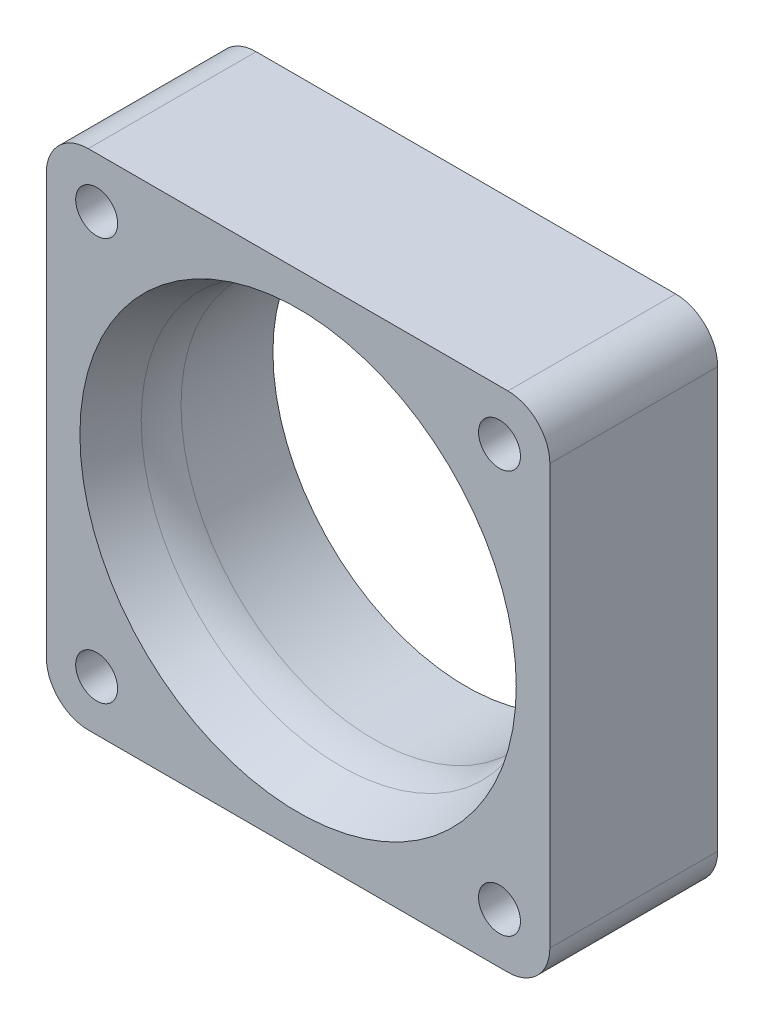
ISO-10303-21;
HEADER;
FILE_DESCRIPTION(('STEP AP214'),'2;1');
FILE_NAME('part.step','',(''),(''),'','','');
FILE_SCHEMA(('AUTOMOTIVE_DESIGN { 1 0 10303 214 1 1 1 1 }'));
ENDSEC;
DATA;
#1=APPLICATION_CONTEXT('core data for automotive mechanical design processes');
#2=APPLICATION_PROTOCOL_DEFINITION('international standard','automotive_design',2000,#1);
#3=PRODUCT_CONTEXT('',#1,'mechanical');
#4=PRODUCT('Part','Part','',(#3));
#5=PRODUCT_RELATED_PRODUCT_CATEGORY('part','',(#4));
#6=PRODUCT_DEFINITION_FORMATION('','',#4);
#7=PRODUCT_DEFINITION_CONTEXT('part definition',#1,'design');
#8=PRODUCT_DEFINITION('design','',#6,#7);
#9=PRODUCT_DEFINITION_SHAPE('','',#8);
#10=(LENGTH_UNIT() NAMED_UNIT(*) SI_UNIT(.MILLI.,.METRE.));
#11=(NAMED_UNIT(*) PLANE_ANGLE_UNIT() SI_UNIT($,.RADIAN.));
#12=(NAMED_UNIT(*) SI_UNIT($,.STERADIAN.) SOLID_ANGLE_UNIT());
#13=UNCERTAINTY_MEASURE_WITH_UNIT(LENGTH_MEASURE(1.E-05),#10,'distance_accuracy_value','');
#14=(GEOMETRIC_REPRESENTATION_CONTEXT(3) GLOBAL_UNCERTAINTY_ASSIGNED_CONTEXT((#13)) GLOBAL_UNIT_ASSIGNED_CONTEXT((#10,
#11,#12)) REPRESENTATION_CONTEXT('',''));
#15=CARTESIAN_POINT('',(0.,0.,0.));
#16=DIRECTION('',(0.,0.,1.));
#17=DIRECTION('',(1.,0.,0.));
#18=AXIS2_PLACEMENT_3D('',#15,#16,#17);
#19=CARTESIAN_POINT('',(15.,-15.,10.));
#20=DIRECTION('',(-1.,0.,0.));
#21=DIRECTION('',(0.,0.,1.));
#22=AXIS2_PLACEMENT_3D('',#19,#20,#21);
#23=PLANE('',#22);
#24=DIRECTION('',(0.,1.,0.));
#25=VECTOR('',#24,1.);
#26=CARTESIAN_POINT('',(15.,-15.,10.));
#27=LINE('',#26,#25);
#28=CARTESIAN_POINT('',(15.,-12.5,10.));
#29=VERTEX_POINT('',#28);
#30=CARTESIAN_POINT('',(15.,12.5,10.));
#31=VERTEX_POINT('',#30);
#32=EDGE_CURVE('E126',#29,#31,#27,.T.);
#33=ORIENTED_EDGE('',*,*,#32,.F.);
#34=DIRECTION('',(0.,0.,-1.));
#35=VECTOR('',#34,1.);
#36=CARTESIAN_POINT('',(15.,-12.5,10.));
#37=LINE('',#36,#35);
#38=CARTESIAN_POINT('',(15.,-12.5,0.));
#39=VERTEX_POINT('',#38);
#40=EDGE_CURVE('E152',#29,#39,#37,.T.);
#41=ORIENTED_EDGE('',*,*,#40,.T.);
#42=DIRECTION('',(0.,1.,0.));
#43=VECTOR('',#42,1.);
#44=CARTESIAN_POINT('',(15.,-15.,0.));
#45=LINE('',#44,#43);
#46=CARTESIAN_POINT('',(15.,12.5,0.));
#47=VERTEX_POINT('',#46);
#48=EDGE_CURVE('E208',#39,#47,#45,.T.);
#49=ORIENTED_EDGE('',*,*,#48,.T.);
#50=DIRECTION('',(0.,0.,-1.));
#51=VECTOR('',#50,1.);
#52=CARTESIAN_POINT('',(15.,12.5,10.));
#53=LINE('',#52,#51);
#54=EDGE_CURVE('E150',#47,#31,#53,.F.);
#55=ORIENTED_EDGE('',*,*,#54,.T.);
#56=EDGE_LOOP('',(#33,#41,#49,#55));
#57=FACE_BOUND('',#56,.T.);
#58=ADVANCED_FACE('F33',(#57),#23,.F.);
#59=CARTESIAN_POINT('',(-15.,15.,10.));
#60=DIRECTION('',(0.,-1.,0.));
#61=DIRECTION('',(0.,0.,-1.));
#62=AXIS2_PLACEMENT_3D('',#59,#60,#61);
#63=PLANE('',#62);
#64=DIRECTION('',(-1.,0.,0.));
#65=VECTOR('',#64,1.);
#66=CARTESIAN_POINT('',(-15.,15.,0.));
#67=LINE('',#66,#65);
#68=CARTESIAN_POINT('',(12.5,15.,0.));
#69=VERTEX_POINT('',#68);
#70=CARTESIAN_POINT('',(-12.5,15.,0.));
#71=VERTEX_POINT('',#70);
#72=EDGE_CURVE('E131',#69,#71,#67,.T.);
#73=ORIENTED_EDGE('',*,*,#72,.T.);
#74=DIRECTION('',(0.,0.,-1.));
#75=VECTOR('',#74,1.);
#76=CARTESIAN_POINT('',(-12.5,15.,10.));
#77=LINE('',#76,#75);
#78=CARTESIAN_POINT('',(-12.5,15.,10.));
#79=VERTEX_POINT('',#78);
#80=EDGE_CURVE('E48',#71,#79,#77,.F.);
#81=ORIENTED_EDGE('',*,*,#80,.T.);
#82=DIRECTION('',(-1.,0.,0.));
#83=VECTOR('',#82,1.);
#84=CARTESIAN_POINT('',(-15.,15.,10.));
#85=LINE('',#84,#83);
#86=CARTESIAN_POINT('',(12.5,15.,10.));
#87=VERTEX_POINT('',#86);
#88=EDGE_CURVE('E129',#87,#79,#85,.T.);
#89=ORIENTED_EDGE('',*,*,#88,.F.);
#90=DIRECTION('',(0.,0.,-1.));
#91=VECTOR('',#90,1.);
#92=CARTESIAN_POINT('',(12.5,15.,10.));
#93=LINE('',#92,#91);
#94=EDGE_CURVE('E155',#87,#69,#93,.T.);
#95=ORIENTED_EDGE('',*,*,#94,.T.);
#96=EDGE_LOOP('',(#73,#81,#89,#95));
#97=FACE_BOUND('',#96,.T.);
#98=ADVANCED_FACE('F174',(#97),#63,.F.);
#99=CARTESIAN_POINT('',(-15.,-15.,10.));
#100=DIRECTION('',(1.,0.,0.));
#101=DIRECTION('',(0.,0.,-1.));
#102=AXIS2_PLACEMENT_3D('',#99,#100,#101);
#103=PLANE('',#102);
#104=DIRECTION('',(0.,-1.,0.));
#105=VECTOR('',#104,1.);
#106=CARTESIAN_POINT('',(-15.,-15.,0.));
#107=LINE('',#106,#105);
#108=CARTESIAN_POINT('',(-15.,12.5,0.));
#109=VERTEX_POINT('',#108);
#110=CARTESIAN_POINT('',(-15.,-12.5,0.));
#111=VERTEX_POINT('',#110);
#112=EDGE_CURVE('E127',#109,#111,#107,.T.);
#113=ORIENTED_EDGE('',*,*,#112,.T.);
#114=DIRECTION('',(0.,0.,-1.));
#115=VECTOR('',#114,1.);
#116=CARTESIAN_POINT('',(-15.,-12.5,10.));
#117=LINE('',#116,#115);
#118=CARTESIAN_POINT('',(-15.,-12.5,10.));
#119=VERTEX_POINT('',#118);
#120=EDGE_CURVE('E105',#111,#119,#117,.F.);
#121=ORIENTED_EDGE('',*,*,#120,.T.);
#122=DIRECTION('',(0.,-1.,0.));
#123=VECTOR('',#122,1.);
#124=CARTESIAN_POINT('',(-15.,-15.,10.));
#125=LINE('',#124,#123);
#126=CARTESIAN_POINT('',(-15.,12.5,10.));
#127=VERTEX_POINT('',#126);
#128=EDGE_CURVE('E213',#127,#119,#125,.T.);
#129=ORIENTED_EDGE('',*,*,#128,.F.);
#130=DIRECTION('',(0.,0.,-1.));
#131=VECTOR('',#130,1.);
#132=CARTESIAN_POINT('',(-15.,12.5,10.));
#133=LINE('',#132,#131);
#134=EDGE_CURVE('E110',#127,#109,#133,.T.);
#135=ORIENTED_EDGE('',*,*,#134,.T.);
#136=EDGE_LOOP('',(#113,#121,#129,#135));
#137=FACE_BOUND('',#136,.T.);
#138=ADVANCED_FACE('F180',(#137),#103,.F.);
#139=CARTESIAN_POINT('',(-15.,-15.,10.));
#140=DIRECTION('',(0.,1.,0.));
#141=DIRECTION('',(0.,0.,1.));
#142=AXIS2_PLACEMENT_3D('',#139,#140,#141);
#143=PLANE('',#142);
#144=DIRECTION('',(1.,0.,0.));
#145=VECTOR('',#144,1.);
#146=CARTESIAN_POINT('',(-15.,-15.,10.));
#147=LINE('',#146,#145);
#148=CARTESIAN_POINT('',(-12.5,-15.,10.));
#149=VERTEX_POINT('',#148);
#150=CARTESIAN_POINT('',(12.5,-15.,10.));
#151=VERTEX_POINT('',#150);
#152=EDGE_CURVE('E120',#149,#151,#147,.T.);
#153=ORIENTED_EDGE('',*,*,#152,.F.);
#154=DIRECTION('',(0.,0.,-1.));
#155=VECTOR('',#154,1.);
#156=CARTESIAN_POINT('',(-12.5,-15.,10.));
#157=LINE('',#156,#155);
#158=CARTESIAN_POINT('',(-12.5,-15.,0.));
#159=VERTEX_POINT('',#158);
#160=EDGE_CURVE('E104',#149,#159,#157,.T.);
#161=ORIENTED_EDGE('',*,*,#160,.T.);
#162=DIRECTION('',(1.,0.,0.));
#163=VECTOR('',#162,1.);
#164=CARTESIAN_POINT('',(-15.,-15.,0.));
#165=LINE('',#164,#163);
#166=CARTESIAN_POINT('',(12.5,-15.,0.));
#167=VERTEX_POINT('',#166);
#168=EDGE_CURVE('E117',#159,#167,#165,.T.);
#169=ORIENTED_EDGE('',*,*,#168,.T.);
#170=DIRECTION('',(0.,0.,-1.));
#171=VECTOR('',#170,1.);
#172=CARTESIAN_POINT('',(12.5,-15.,10.));
#173=LINE('',#172,#171);
#174=EDGE_CURVE('E122',#167,#151,#173,.F.);
#175=ORIENTED_EDGE('',*,*,#174,.T.);
#176=EDGE_LOOP('',(#153,#161,#169,#175));
#177=FACE_BOUND('',#176,.T.);
#178=ADVANCED_FACE('F116',(#177),#143,.F.);
#179=CARTESIAN_POINT('',(0.,0.,10.));
#180=DIRECTION('',(0.,0.,-1.));
#181=DIRECTION('',(-1.,0.,0.));
#182=AXIS2_PLACEMENT_3D('',#179,#180,#181);
#183=PLANE('',#182);
#184=CARTESIAN_POINT('',(0.,0.,10.));
#185=DIRECTION('',(0.,0.,-1.));
#186=DIRECTION('',(-1.,0.,0.));
#187=AXIS2_PLACEMENT_3D('',#184,#185,#186);
#188=CIRCLE('',#187,13.);
#189=CARTESIAN_POINT('',(-13.,0.,10.));
#190=VERTEX_POINT('',#189);
#191=EDGE_CURVE('E238',#190,#190,#188,.T.);
#192=ORIENTED_EDGE('',*,*,#191,.T.);
#193=EDGE_LOOP('',(#192));
#194=FACE_BOUND('',#193,.T.);
#195=CARTESIAN_POINT('',(-12.,-12.,10.));
#196=DIRECTION('',(0.,0.,1.));
#197=DIRECTION('',(1.,0.,0.));
#198=AXIS2_PLACEMENT_3D('',#195,#196,#197);
#199=CIRCLE('',#198,1.25);
#200=CARTESIAN_POINT('',(-10.75,-12.,10.));
#201=VERTEX_POINT('',#200);
#202=EDGE_CURVE('E235',#201,#201,#199,.T.);
#203=ORIENTED_EDGE('',*,*,#202,.F.);
#204=EDGE_LOOP('',(#203));
#205=FACE_BOUND('',#204,.T.);
#206=CARTESIAN_POINT('',(12.,-12.,10.));
#207=DIRECTION('',(0.,0.,1.));
#208=DIRECTION('',(1.,0.,0.));
#209=AXIS2_PLACEMENT_3D('',#206,#207,#208);
#210=CIRCLE('',#209,1.25);
#211=CARTESIAN_POINT('',(13.25,-12.,10.));
#212=VERTEX_POINT('',#211);
#213=EDGE_CURVE('E229',#212,#212,#210,.T.);
#214=ORIENTED_EDGE('',*,*,#213,.F.);
#215=EDGE_LOOP('',(#214));
#216=FACE_BOUND('',#215,.T.);
#217=CARTESIAN_POINT('',(12.,12.,10.));
#218=DIRECTION('',(0.,0.,1.));
#219=DIRECTION('',(1.,0.,0.));
#220=AXIS2_PLACEMENT_3D('',#217,#218,#219);
#221=CIRCLE('',#220,1.25);
#222=CARTESIAN_POINT('',(13.25,12.,10.));
#223=VERTEX_POINT('',#222);
#224=EDGE_CURVE('E223',#223,#223,#221,.T.);
#225=ORIENTED_EDGE('',*,*,#224,.F.);
#226=EDGE_LOOP('',(#225));
#227=FACE_BOUND('',#226,.T.);
#228=CARTESIAN_POINT('',(-12.,12.,10.));
#229=DIRECTION('',(0.,0.,1.));
#230=DIRECTION('',(1.,0.,0.));
#231=AXIS2_PLACEMENT_3D('',#228,#229,#230);
#232=CIRCLE('',#231,1.25);
#233=CARTESIAN_POINT('',(-10.75,12.,10.));
#234=VERTEX_POINT('',#233);
#235=EDGE_CURVE('E217',#234,#234,#232,.T.);
#236=ORIENTED_EDGE('',*,*,#235,.F.);
#237=EDGE_LOOP('',(#236));
#238=FACE_BOUND('',#237,.T.);
#239=ORIENTED_EDGE('',*,*,#128,.T.);
#240=CARTESIAN_POINT('',(-12.5,-12.5,10.));
#241=DIRECTION('',(0.,0.,-1.));
#242=DIRECTION('',(-1.,0.,0.));
#243=AXIS2_PLACEMENT_3D('',#240,#241,#242);
#244=CIRCLE('',#243,2.5);
#245=EDGE_CURVE('E148',#119,#149,#244,.F.);
#246=ORIENTED_EDGE('',*,*,#245,.T.);
#247=ORIENTED_EDGE('',*,*,#152,.T.);
#248=CARTESIAN_POINT('',(12.5,-12.5,10.));
#249=DIRECTION('',(0.,0.,-1.));
#250=DIRECTION('',(-1.,0.,0.));
#251=AXIS2_PLACEMENT_3D('',#248,#249,#250);
#252=CIRCLE('',#251,2.5);
#253=EDGE_CURVE('E146',#151,#29,#252,.F.);
#254=ORIENTED_EDGE('',*,*,#253,.T.);
#255=ORIENTED_EDGE('',*,*,#32,.T.);
#256=CARTESIAN_POINT('',(12.5,12.5,10.));
#257=DIRECTION('',(0.,0.,-1.));
#258=DIRECTION('',(-1.,0.,0.));
#259=AXIS2_PLACEMENT_3D('',#256,#257,#258);
#260=CIRCLE('',#259,2.5);
#261=EDGE_CURVE('E55',#31,#87,#260,.F.);
#262=ORIENTED_EDGE('',*,*,#261,.T.);
#263=ORIENTED_EDGE('',*,*,#88,.T.);
#264=CARTESIAN_POINT('',(-12.5,12.5,10.));
#265=DIRECTION('',(0.,0.,-1.));
#266=DIRECTION('',(-1.,0.,0.));
#267=AXIS2_PLACEMENT_3D('',#264,#265,#266);
#268=CIRCLE('',#267,2.5);
#269=EDGE_CURVE('E144',#79,#127,#268,.F.);
#270=ORIENTED_EDGE('',*,*,#269,.T.);
#271=EDGE_LOOP('',(#239,#246,#247,#254,#255,#262,#263,#270));
#272=FACE_BOUND('',#271,.T.);
#273=ADVANCED_FACE('F250',(#194,#205,#216,#227,#238,#272),#183,.F.);
#274=CARTESIAN_POINT('',(0.,0.,0.));
#275=DIRECTION('',(0.,0.,-1.));
#276=DIRECTION('',(-1.,0.,0.));
#277=AXIS2_PLACEMENT_3D('',#274,#275,#276);
#278=PLANE('',#277);
#279=CARTESIAN_POINT('',(0.,0.,0.));
#280=DIRECTION('',(0.,0.,-1.));
#281=DIRECTION('',(-1.,0.,0.));
#282=AXIS2_PLACEMENT_3D('',#279,#280,#281);
#283=CIRCLE('',#282,11.5);
#284=CARTESIAN_POINT('',(-11.5,0.,0.));
#285=VERTEX_POINT('',#284);
#286=EDGE_CURVE('E243',#285,#285,#283,.T.);
#287=ORIENTED_EDGE('',*,*,#286,.F.);
#288=EDGE_LOOP('',(#287));
#289=FACE_BOUND('',#288,.T.);
#290=CARTESIAN_POINT('',(-12.,-12.,0.));
#291=DIRECTION('',(0.,0.,1.));
#292=DIRECTION('',(1.,0.,0.));
#293=AXIS2_PLACEMENT_3D('',#290,#291,#292);
#294=CIRCLE('',#293,1.25);
#295=CARTESIAN_POINT('',(-10.75,-12.,0.));
#296=VERTEX_POINT('',#295);
#297=EDGE_CURVE('E232',#296,#296,#294,.T.);
#298=ORIENTED_EDGE('',*,*,#297,.T.);
#299=EDGE_LOOP('',(#298));
#300=FACE_BOUND('',#299,.T.);
#301=CARTESIAN_POINT('',(12.,-12.,0.));
#302=DIRECTION('',(0.,0.,1.));
#303=DIRECTION('',(1.,0.,0.));
#304=AXIS2_PLACEMENT_3D('',#301,#302,#303);
#305=CIRCLE('',#304,1.25);
#306=CARTESIAN_POINT('',(13.25,-12.,0.));
#307=VERTEX_POINT('',#306);
#308=EDGE_CURVE('E226',#307,#307,#305,.T.);
#309=ORIENTED_EDGE('',*,*,#308,.T.);
#310=EDGE_LOOP('',(#309));
#311=FACE_BOUND('',#310,.T.);
#312=CARTESIAN_POINT('',(12.,12.,0.));
#313=DIRECTION('',(0.,0.,1.));
#314=DIRECTION('',(1.,0.,0.));
#315=AXIS2_PLACEMENT_3D('',#312,#313,#314);
#316=CIRCLE('',#315,1.25);
#317=CARTESIAN_POINT('',(13.25,12.,0.));
#318=VERTEX_POINT('',#317);
#319=EDGE_CURVE('E220',#318,#318,#316,.T.);
#320=ORIENTED_EDGE('',*,*,#319,.T.);
#321=EDGE_LOOP('',(#320));
#322=FACE_BOUND('',#321,.T.);
#323=CARTESIAN_POINT('',(-12.,12.,0.));
#324=DIRECTION('',(0.,0.,1.));
#325=DIRECTION('',(1.,0.,0.));
#326=AXIS2_PLACEMENT_3D('',#323,#324,#325);
#327=CIRCLE('',#326,1.25);
#328=CARTESIAN_POINT('',(-10.75,12.,0.));
#329=VERTEX_POINT('',#328);
#330=EDGE_CURVE('E209',#329,#329,#327,.T.);
#331=ORIENTED_EDGE('',*,*,#330,.T.);
#332=EDGE_LOOP('',(#331));
#333=FACE_BOUND('',#332,.T.);
#334=ORIENTED_EDGE('',*,*,#168,.F.);
#335=CARTESIAN_POINT('',(-12.5,-12.5,0.));
#336=DIRECTION('',(0.,0.,-1.));
#337=DIRECTION('',(-1.,0.,0.));
#338=AXIS2_PLACEMENT_3D('',#335,#336,#337);
#339=CIRCLE('',#338,2.5);
#340=EDGE_CURVE('E100',#159,#111,#339,.T.);
#341=ORIENTED_EDGE('',*,*,#340,.T.);
#342=ORIENTED_EDGE('',*,*,#112,.F.);
#343=CARTESIAN_POINT('',(-12.5,12.5,0.));
#344=DIRECTION('',(0.,0.,-1.));
#345=DIRECTION('',(-1.,0.,0.));
#346=AXIS2_PLACEMENT_3D('',#343,#344,#345);
#347=CIRCLE('',#346,2.5);
#348=EDGE_CURVE('E137',#109,#71,#347,.T.);
#349=ORIENTED_EDGE('',*,*,#348,.T.);
#350=ORIENTED_EDGE('',*,*,#72,.F.);
#351=CARTESIAN_POINT('',(12.5,12.5,0.));
#352=DIRECTION('',(0.,0.,-1.));
#353=DIRECTION('',(-1.,0.,0.));
#354=AXIS2_PLACEMENT_3D('',#351,#352,#353);
#355=CIRCLE('',#354,2.5);
#356=EDGE_CURVE('E121',#69,#47,#355,.T.);
#357=ORIENTED_EDGE('',*,*,#356,.T.);
#358=ORIENTED_EDGE('',*,*,#48,.F.);
#359=CARTESIAN_POINT('',(12.5,-12.5,0.));
#360=DIRECTION('',(0.,0.,-1.));
#361=DIRECTION('',(-1.,0.,0.));
#362=AXIS2_PLACEMENT_3D('',#359,#360,#361);
#363=CIRCLE('',#362,2.5);
#364=EDGE_CURVE('E111',#39,#167,#363,.T.);
#365=ORIENTED_EDGE('',*,*,#364,.T.);
#366=EDGE_LOOP('',(#334,#341,#342,#349,#350,#357,#358,#365));
#367=FACE_BOUND('',#366,.T.);
#368=ADVANCED_FACE('F124',(#289,#300,#311,#322,#333,#367),#278,.T.);
#369=CARTESIAN_POINT('',(-12.5,-12.5,10.));
#370=DIRECTION('',(0.,0.,-1.));
#371=DIRECTION('',(-1.,0.,0.));
#372=AXIS2_PLACEMENT_3D('',#369,#370,#371);
#373=CYLINDRICAL_SURFACE('',#372,2.5);
#374=ORIENTED_EDGE('',*,*,#245,.F.);
#375=ORIENTED_EDGE('',*,*,#120,.F.);
#376=ORIENTED_EDGE('',*,*,#340,.F.);
#377=ORIENTED_EDGE('',*,*,#160,.F.);
#378=EDGE_LOOP('',(#374,#375,#376,#377));
#379=FACE_BOUND('',#378,.T.);
#380=ADVANCED_FACE('F103',(#379),#373,.T.);
#381=CARTESIAN_POINT('',(12.5,-12.5,10.));
#382=DIRECTION('',(0.,0.,-1.));
#383=DIRECTION('',(-1.,0.,0.));
#384=AXIS2_PLACEMENT_3D('',#381,#382,#383);
#385=CYLINDRICAL_SURFACE('',#384,2.5);
#386=ORIENTED_EDGE('',*,*,#253,.F.);
#387=ORIENTED_EDGE('',*,*,#174,.F.);
#388=ORIENTED_EDGE('',*,*,#364,.F.);
#389=ORIENTED_EDGE('',*,*,#40,.F.);
#390=EDGE_LOOP('',(#386,#387,#388,#389));
#391=FACE_BOUND('',#390,.T.);
#392=ADVANCED_FACE('F187',(#391),#385,.T.);
#393=CARTESIAN_POINT('',(-12.5,12.5,10.));
#394=DIRECTION('',(0.,0.,-1.));
#395=DIRECTION('',(-1.,0.,0.));
#396=AXIS2_PLACEMENT_3D('',#393,#394,#395);
#397=CYLINDRICAL_SURFACE('',#396,2.5);
#398=ORIENTED_EDGE('',*,*,#269,.F.);
#399=ORIENTED_EDGE('',*,*,#80,.F.);
#400=ORIENTED_EDGE('',*,*,#348,.F.);
#401=ORIENTED_EDGE('',*,*,#134,.F.);
#402=EDGE_LOOP('',(#398,#399,#400,#401));
#403=FACE_BOUND('',#402,.T.);
#404=ADVANCED_FACE('F190',(#403),#397,.T.);
#405=CARTESIAN_POINT('',(12.5,12.5,10.));
#406=DIRECTION('',(0.,0.,-1.));
#407=DIRECTION('',(-1.,0.,0.));
#408=AXIS2_PLACEMENT_3D('',#405,#406,#407);
#409=CYLINDRICAL_SURFACE('',#408,2.5);
#410=ORIENTED_EDGE('',*,*,#261,.F.);
#411=ORIENTED_EDGE('',*,*,#54,.F.);
#412=ORIENTED_EDGE('',*,*,#356,.F.);
#413=ORIENTED_EDGE('',*,*,#94,.F.);
#414=EDGE_LOOP('',(#410,#411,#412,#413));
#415=FACE_BOUND('',#414,.T.);
#416=ADVANCED_FACE('F193',(#415),#409,.T.);
#417=CARTESIAN_POINT('',(-12.,12.,0.));
#418=DIRECTION('',(0.,0.,1.));
#419=DIRECTION('',(1.,0.,0.));
#420=AXIS2_PLACEMENT_3D('',#417,#418,#419);
#421=CYLINDRICAL_SURFACE('',#420,1.25);
#422=ORIENTED_EDGE('',*,*,#330,.F.);
#423=EDGE_LOOP('',(#422));
#424=FACE_BOUND('',#423,.T.);
#425=ORIENTED_EDGE('',*,*,#235,.T.);
#426=EDGE_LOOP('',(#425));
#427=FACE_BOUND('',#426,.T.);
#428=ADVANCED_FACE('F196',(#424,#427),#421,.F.);
#429=CARTESIAN_POINT('',(12.,12.,0.));
#430=DIRECTION('',(0.,0.,1.));
#431=DIRECTION('',(1.,0.,0.));
#432=AXIS2_PLACEMENT_3D('',#429,#430,#431);
#433=CYLINDRICAL_SURFACE('',#432,1.25);
#434=ORIENTED_EDGE('',*,*,#319,.F.);
#435=EDGE_LOOP('',(#434));
#436=FACE_BOUND('',#435,.T.);
#437=ORIENTED_EDGE('',*,*,#224,.T.);
#438=EDGE_LOOP('',(#437));
#439=FACE_BOUND('',#438,.T.);
#440=ADVANCED_FACE('F201',(#436,#439),#433,.F.);
#441=CARTESIAN_POINT('',(12.,-12.,0.));
#442=DIRECTION('',(0.,0.,1.));
#443=DIRECTION('',(1.,0.,0.));
#444=AXIS2_PLACEMENT_3D('',#441,#442,#443);
#445=CYLINDRICAL_SURFACE('',#444,1.25);
#446=ORIENTED_EDGE('',*,*,#308,.F.);
#447=EDGE_LOOP('',(#446));
#448=FACE_BOUND('',#447,.T.);
#449=ORIENTED_EDGE('',*,*,#213,.T.);
#450=EDGE_LOOP('',(#449));
#451=FACE_BOUND('',#450,.T.);
#452=ADVANCED_FACE('F277',(#448,#451),#445,.F.);
#453=CARTESIAN_POINT('',(-12.,-12.,0.));
#454=DIRECTION('',(0.,0.,1.));
#455=DIRECTION('',(1.,0.,0.));
#456=AXIS2_PLACEMENT_3D('',#453,#454,#455);
#457=CYLINDRICAL_SURFACE('',#456,1.25);
#458=ORIENTED_EDGE('',*,*,#297,.F.);
#459=EDGE_LOOP('',(#458));
#460=FACE_BOUND('',#459,.T.);
#461=ORIENTED_EDGE('',*,*,#202,.T.);
#462=EDGE_LOOP('',(#461));
#463=FACE_BOUND('',#462,.T.);
#464=ADVANCED_FACE('F281',(#460,#463),#457,.F.);
#465=CARTESIAN_POINT('',(0.,0.,6.5));
#466=DIRECTION('',(0.,0.,1.));
#467=DIRECTION('',(1.,0.,0.));
#468=AXIS2_PLACEMENT_3D('',#465,#466,#467);
#469=CONICAL_SURFACE('',#468,11.5,0.404891786285083);
#470=CARTESIAN_POINT('',(0.,0.,7.44330798312266));
#471=DIRECTION('',(0.,0.,-1.));
#472=DIRECTION('',(-1.,0.,0.));
#473=AXIS2_PLACEMENT_3D('',#470,#471,#472);
#474=CIRCLE('',#473,11.9042748499097);
#475=CARTESIAN_POINT('',(-11.9042748499097,0.,7.44330798312266));
#476=VERTEX_POINT('',#475);
#477=EDGE_CURVE('E41',#476,#476,#474,.T.);
#478=ORIENTED_EDGE('',*,*,#477,.T.);
#479=EDGE_LOOP('',(#478));
#480=FACE_BOUND('',#479,.T.);
#481=ORIENTED_EDGE('',*,*,#191,.F.);
#482=EDGE_LOOP('',(#481));
#483=FACE_BOUND('',#482,.T.);
#484=ADVANCED_FACE('F161',(#480,#483),#469,.F.);
#485=CARTESIAN_POINT('',(0.,0.,0.));
#486=DIRECTION('',(0.,0.,-1.));
#487=DIRECTION('',(-1.,0.,0.));
#488=AXIS2_PLACEMENT_3D('',#485,#486,#487);
#489=CYLINDRICAL_SURFACE('',#488,11.5);
#490=CARTESIAN_POINT('',(0.,0.,5.47371149022682));
#491=DIRECTION('',(0.,0.,1.));
#492=DIRECTION('',(1.,0.,0.));
#493=AXIS2_PLACEMENT_3D('',#490,#491,#492);
#494=CIRCLE('',#493,11.5);
#495=CARTESIAN_POINT('',(11.5,0.,5.47371149022682));
#496=VERTEX_POINT('',#495);
#497=EDGE_CURVE('E11',#496,#496,#494,.T.);
#498=ORIENTED_EDGE('',*,*,#497,.T.);
#499=EDGE_LOOP('',(#498));
#500=FACE_BOUND('',#499,.T.);
#501=ORIENTED_EDGE('',*,*,#286,.T.);
#502=EDGE_LOOP('',(#501));
#503=FACE_BOUND('',#502,.T.);
#504=ADVANCED_FACE('F165',(#500,#503),#489,.F.);
#505=CARTESIAN_POINT('',(0.,0.,5.47371149022682));
#506=DIRECTION('',(0.,0.,1.));
#507=DIRECTION('',(1.,0.,0.));
#508=AXIS2_PLACEMENT_3D('',#505,#506,#507);
#509=TOROIDAL_SURFACE('',#508,16.5,5.);
#510=ORIENTED_EDGE('',*,*,#497,.F.);
#511=EDGE_LOOP('',(#510));
#512=FACE_BOUND('',#511,.T.);
#513=ORIENTED_EDGE('',*,*,#477,.F.);
#514=EDGE_LOOP('',(#513));
#515=FACE_BOUND('',#514,.T.);
#516=ADVANCED_FACE('F35',(#512,#515),#509,.T.);
#517=CLOSED_SHELL('',(#58,#98,#138,#178,#273,#368,#380,#392,#404,#416,#428,#440,#452,#464,#484,
#504,#516));
#518=MANIFOLD_SOLID_BREP('B2',#517);
#519=ADVANCED_BREP_SHAPE_REPRESENTATION('',(#18,#518),#14);
#520=SHAPE_DEFINITION_REPRESENTATION(#9,#519);
ENDSEC;
END-ISO-10303-21;
